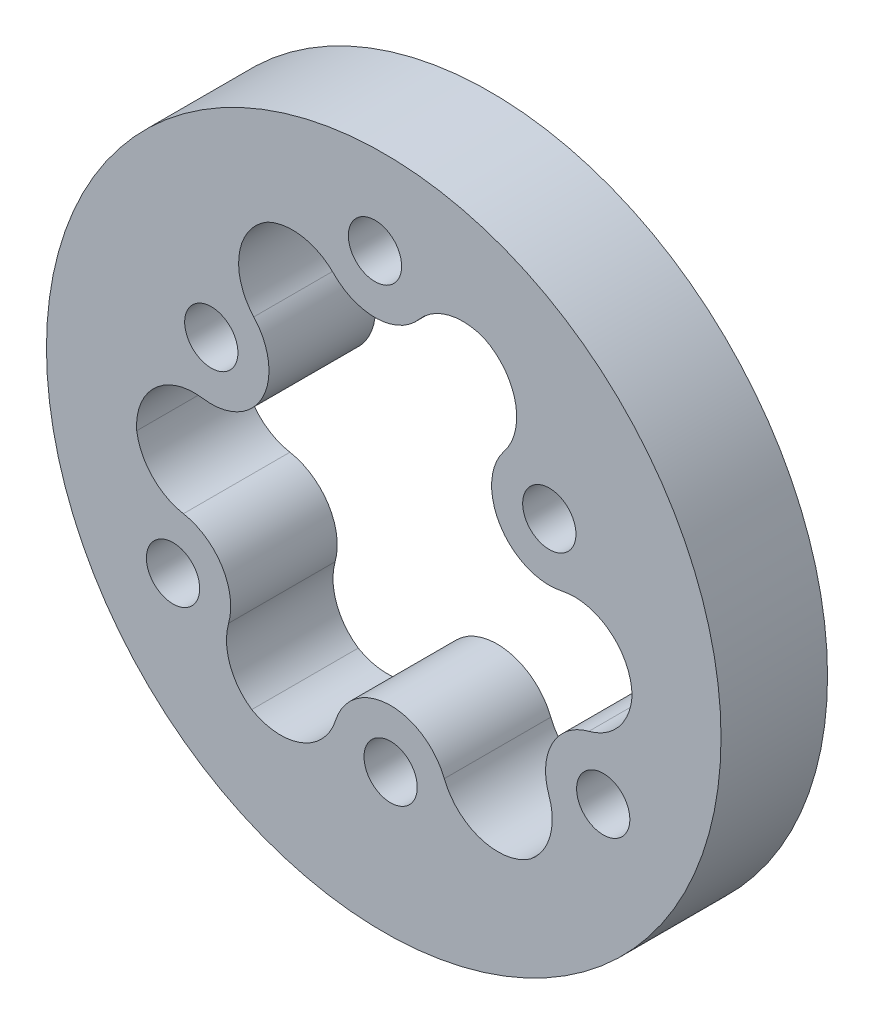
ISO-10303-21;
HEADER;
FILE_DESCRIPTION(('STEP AP214'),'2;1');
FILE_NAME('part.step','',(''),(''),'','','');
FILE_SCHEMA(('AUTOMOTIVE_DESIGN { 1 0 10303 214 1 1 1 1 }'));
ENDSEC;
DATA;
#1=APPLICATION_CONTEXT('core data for automotive mechanical design processes');
#2=APPLICATION_PROTOCOL_DEFINITION('international standard','automotive_design',2000,#1);
#3=PRODUCT_CONTEXT('',#1,'mechanical');
#4=PRODUCT('Part','Part','',(#3));
#5=PRODUCT_RELATED_PRODUCT_CATEGORY('part','',(#4));
#6=PRODUCT_DEFINITION_FORMATION('','',#4);
#7=PRODUCT_DEFINITION_CONTEXT('part definition',#1,'design');
#8=PRODUCT_DEFINITION('design','',#6,#7);
#9=PRODUCT_DEFINITION_SHAPE('','',#8);
#10=(LENGTH_UNIT() NAMED_UNIT(*) SI_UNIT(.MILLI.,.METRE.));
#11=(NAMED_UNIT(*) PLANE_ANGLE_UNIT() SI_UNIT($,.RADIAN.));
#12=(NAMED_UNIT(*) SI_UNIT($,.STERADIAN.) SOLID_ANGLE_UNIT());
#13=UNCERTAINTY_MEASURE_WITH_UNIT(LENGTH_MEASURE(1.E-05),#10,'distance_accuracy_value','');
#14=(GEOMETRIC_REPRESENTATION_CONTEXT(3) GLOBAL_UNCERTAINTY_ASSIGNED_CONTEXT((#13)) GLOBAL_UNIT_ASSIGNED_CONTEXT((#10,
#11,#12)) REPRESENTATION_CONTEXT('',''));
#15=CARTESIAN_POINT('',(0.,0.,0.));
#16=DIRECTION('',(0.,0.,1.));
#17=DIRECTION('',(1.,0.,0.));
#18=AXIS2_PLACEMENT_3D('',#15,#16,#17);
#19=CARTESIAN_POINT('',(0.,0.,6.));
#20=DIRECTION('',(0.,0.,1.));
#21=DIRECTION('',(1.,0.,0.));
#22=AXIS2_PLACEMENT_3D('',#19,#20,#21);
#23=PLANE('',#22);
#24=CARTESIAN_POINT('',(9.32635694032615,5.83258658072301,6.));
#25=DIRECTION('',(0.,0.,1.));
#26=DIRECTION('',(1.,0.,0.));
#27=AXIS2_PLACEMENT_3D('',#24,#25,#26);
#28=CIRCLE('',#27,1.50000000000002);
#29=CARTESIAN_POINT('',(10.8263569403262,5.83258658072301,6.));
#30=VERTEX_POINT('',#29);
#31=EDGE_CURVE('E333',#30,#30,#28,.T.);
#32=ORIENTED_EDGE('',*,*,#31,.F.);
#33=EDGE_LOOP('',(#32));
#34=FACE_BOUND('',#33,.T.);
#35=CARTESIAN_POINT('',(-11.8699088331424,-7.4232920118292,6.));
#36=DIRECTION('',(0.,0.,1.));
#37=DIRECTION('',(1.,0.,0.));
#38=AXIS2_PLACEMENT_3D('',#35,#36,#37);
#39=CIRCLE('',#38,1.50000000000014);
#40=CARTESIAN_POINT('',(-10.3699088331423,-7.4232920118292,6.));
#41=VERTEX_POINT('',#40);
#42=EDGE_CURVE('E216',#41,#41,#39,.T.);
#43=ORIENTED_EDGE('',*,*,#42,.F.);
#44=EDGE_LOOP('',(#43));
#45=FACE_BOUND('',#44,.T.);
#46=CARTESIAN_POINT('',(-0.493805045382954,13.9912885960213,6.));
#47=DIRECTION('',(0.,0.,1.));
#48=DIRECTION('',(1.,0.,0.));
#49=AXIS2_PLACEMENT_3D('',#46,#47,#48);
#50=CIRCLE('',#49,1.5);
#51=CARTESIAN_POINT('',(1.00619495461705,13.9912885960213,6.));
#52=VERTEX_POINT('',#51);
#53=EDGE_CURVE('E302',#52,#52,#50,.T.);
#54=ORIENTED_EDGE('',*,*,#53,.F.);
#55=EDGE_LOOP('',(#54));
#56=FACE_BOUND('',#55,.T.);
#57=CARTESIAN_POINT('',(0.,0.,6.));
#58=DIRECTION('',(0.,0.,1.));
#59=DIRECTION('',(1.,0.,0.));
#60=AXIS2_PLACEMENT_3D('',#57,#58,#59);
#61=CIRCLE('',#60,19.);
#62=CARTESIAN_POINT('',(19.,0.,6.));
#63=VERTEX_POINT('',#62);
#64=EDGE_CURVE('E11',#63,#63,#61,.T.);
#65=ORIENTED_EDGE('',*,*,#64,.T.);
#66=EDGE_LOOP('',(#65));
#67=FACE_BOUND('',#66,.T.);
#68=CARTESIAN_POINT('',(12.3637138785254,-6.56799658419206,6.));
#69=DIRECTION('',(0.,0.,1.));
#70=DIRECTION('',(1.,0.,0.));
#71=AXIS2_PLACEMENT_3D('',#68,#69,#70);
#72=CIRCLE('',#71,1.50000000000007);
#73=CARTESIAN_POINT('',(13.8637138785255,-6.56799658419206,6.));
#74=VERTEX_POINT('',#73);
#75=EDGE_CURVE('E296',#74,#74,#72,.T.);
#76=ORIENTED_EDGE('',*,*,#75,.F.);
#77=EDGE_LOOP('',(#76));
#78=FACE_BOUND('',#77,.T.);
#79=CARTESIAN_POINT('',(10.7377849521311,-0.512322478317354,6.));
#80=DIRECTION('',(0.,0.,1.));
#81=DIRECTION('',(1.,0.,0.));
#82=AXIS2_PLACEMENT_3D('',#79,#80,#81);
#83=CIRCLE('',#82,3.25000000000007);
#84=CARTESIAN_POINT('',(13.9877846391168,-0.510896086633181,6.));
#85=VERTEX_POINT('',#84);
#86=CARTESIAN_POINT('',(10.0320709462286,2.66013205120283,6.));
#87=VERTEX_POINT('',#86);
#88=EDGE_CURVE('E166',#85,#87,#83,.T.);
#89=ORIENTED_EDGE('',*,*,#88,.F.);
#90=CARTESIAN_POINT('',(10.7465486850771,-0.272380908414255,6.));
#91=DIRECTION('',(0.,0.,1.));
#92=DIRECTION('',(1.,0.,0.));
#93=AXIS2_PLACEMENT_3D('',#90,#91,#92);
#94=CIRCLE('',#93,3.25000000000007);
#95=CARTESIAN_POINT('',(11.5551312818012,-3.42018874630315,6.));
#96=VERTEX_POINT('',#95);
#97=EDGE_CURVE('E158',#96,#85,#94,.T.);
#98=ORIENTED_EDGE('',*,*,#97,.F.);
#99=CARTESIAN_POINT('',(12.3637138785254,-6.56799658419206,6.));
#100=DIRECTION('',(0.,0.,-1.));
#101=DIRECTION('',(1.,0.,0.));
#102=AXIS2_PLACEMENT_3D('',#99,#100,#101);
#103=CIRCLE('',#102,3.25);
#104=CARTESIAN_POINT('',(9.30272212200573,-7.66016390952212,6.));
#105=VERTEX_POINT('',#104);
#106=EDGE_CURVE('E213',#105,#96,#103,.T.);
#107=ORIENTED_EDGE('',*,*,#106,.F.);
#108=CARTESIAN_POINT('',(6.24173036548606,-8.75233123485219,6.));
#109=DIRECTION('',(0.,0.,1.));
#110=DIRECTION('',(1.,0.,0.));
#111=AXIS2_PLACEMENT_3D('',#108,#109,#110);
#112=CIRCLE('',#111,3.25000000000003);
#113=CARTESIAN_POINT('',(8.25384663526143,-11.3045632221342,6.));
#114=VERTEX_POINT('',#113);
#115=EDGE_CURVE('E211',#114,#105,#112,.T.);
#116=ORIENTED_EDGE('',*,*,#115,.F.);
#117=CARTESIAN_POINT('',(6.43564489280904,-8.61074763383888,6.));
#118=DIRECTION('',(0.,0.,1.));
#119=DIRECTION('',(1.,0.,0.));
#120=AXIS2_PLACEMENT_3D('',#117,#118,#119);
#121=CIRCLE('',#120,3.24999999999999);
#122=CARTESIAN_POINT('',(3.41181728566217,-9.80195147964207,6.));
#123=VERTEX_POINT('',#122);
#124=EDGE_CURVE('E209',#123,#114,#121,.T.);
#125=ORIENTED_EDGE('',*,*,#124,.F.);
#126=CARTESIAN_POINT('',(0.387989678515268,-10.9931553254453,6.));
#127=DIRECTION('',(0.,0.,-1.));
#128=DIRECTION('',(1.,0.,0.));
#129=AXIS2_PLACEMENT_3D('',#126,#127,#128);
#130=CIRCLE('',#129,3.25);
#131=CARTESIAN_POINT('',(-2.71229353935144,-10.0180943176032,6.));
#132=VERTEX_POINT('',#131);
#133=EDGE_CURVE('E207',#132,#123,#130,.T.);
#134=ORIENTED_EDGE('',*,*,#133,.F.);
#135=CARTESIAN_POINT('',(-5.81257675721816,-9.0430333097611,6.));
#136=DIRECTION('',(0.,0.,1.));
#137=DIRECTION('',(1.,0.,0.));
#138=AXIS2_PLACEMENT_3D('',#135,#136,#137);
#139=CIRCLE('',#138,3.25);
#140=CARTESIAN_POINT('',(-7.43634130927706,-11.858328796824,6.));
#141=VERTEX_POINT('',#140);
#142=EDGE_CURVE('E205',#141,#132,#139,.T.);
#143=ORIENTED_EDGE('',*,*,#142,.F.);
#144=CARTESIAN_POINT('',(-5.60916312873115,-9.17059371007586,6.));
#145=DIRECTION('',(0.,0.,1.));
#146=DIRECTION('',(1.,0.,0.));
#147=AXIS2_PLACEMENT_3D('',#144,#145,#146);
#148=CIRCLE('',#147,3.25000000000002);
#149=CARTESIAN_POINT('',(-8.73953598093682,-8.29694286095252,6.));
#150=VERTEX_POINT('',#149);
#151=EDGE_CURVE('E203',#150,#141,#148,.T.);
#152=ORIENTED_EDGE('',*,*,#151,.F.);
#153=CARTESIAN_POINT('',(-11.8699088331424,-7.4232920118292,6.));
#154=DIRECTION('',(0.,0.,-1.));
#155=DIRECTION('',(1.,0.,0.));
#156=AXIS2_PLACEMENT_3D('',#153,#154,#155);
#157=CIRCLE('',#156,3.25);
#158=CARTESIAN_POINT('',(-11.2852576038017,-4.22631172724338,6.));
#159=VERTEX_POINT('',#158);
#160=EDGE_CURVE('E201',#159,#150,#157,.T.);
#161=ORIENTED_EDGE('',*,*,#160,.F.);
#162=CARTESIAN_POINT('',(-10.7006063744611,-1.02933144265756,6.));
#163=DIRECTION('',(0.,0.,1.));
#164=DIRECTION('',(1.,0.,0.));
#165=AXIS2_PLACEMENT_3D('',#162,#163,#164);
#166=CIRCLE('',#165,3.25);
#167=CARTESIAN_POINT('',(-13.9169622466862,-1.49575925400966,6.));
#168=VERTEX_POINT('',#167);
#169=EDGE_CURVE('E199',#168,#159,#166,.T.);
#170=ORIENTED_EDGE('',*,*,#169,.F.);
#171=CARTESIAN_POINT('',(-10.6749486428857,-1.26805814998879,6.));
#172=DIRECTION('',(0.,0.,1.));
#173=DIRECTION('',(1.,0.,0.));
#174=AXIS2_PLACEMENT_3D('',#171,#172,#173);
#175=CIRCLE('',#174,3.25);
#176=CARTESIAN_POINT('',(-10.1946476308636,1.94625529736673,6.));
#177=VERTEX_POINT('',#176);
#178=EDGE_CURVE('E197',#177,#168,#175,.T.);
#179=ORIENTED_EDGE('',*,*,#178,.F.);
#180=CARTESIAN_POINT('',(-9.71434661884143,5.16056874472224,6.));
#181=DIRECTION('',(0.,0.,-1.));
#182=DIRECTION('',(1.,0.,0.));
#183=AXIS2_PLACEMENT_3D('',#180,#181,#182);
#184=CIRCLE('',#183,3.25);
#185=CARTESIAN_POINT('',(-7.31977740687714,7.35796226640032,6.));
#186=VERTEX_POINT('',#185);
#187=EDGE_CURVE('E195',#186,#177,#184,.T.);
#188=ORIENTED_EDGE('',*,*,#187,.F.);
#189=CARTESIAN_POINT('',(-4.92520819491286,9.55535578807839,6.));
#190=DIRECTION('',(0.,0.,1.));
#191=DIRECTION('',(1.,0.,0.));
#192=AXIS2_PLACEMENT_3D('',#189,#190,#191);
#193=CIRCLE('',#192,3.25);
#194=CARTESIAN_POINT('',(-6.55144332983929,12.3692248834577,6.));
#195=VERTEX_POINT('',#194);
#196=EDGE_CURVE('E193',#195,#186,#193,.T.);
#197=ORIENTED_EDGE('',*,*,#196,.F.);
#198=CARTESIAN_POINT('',(-5.1373855563459,9.44297461849011,6.));
#199=DIRECTION('',(0.,0.,1.));
#200=DIRECTION('',(1.,0.,0.));
#201=AXIS2_PLACEMENT_3D('',#198,#199,#200);
#202=CIRCLE('',#201,3.25);
#203=CARTESIAN_POINT('',(-2.81559530086442,11.7171316072557,6.));
#204=VERTEX_POINT('',#203);
#205=EDGE_CURVE('E191',#204,#195,#202,.T.);
#206=ORIENTED_EDGE('',*,*,#205,.F.);
#207=CARTESIAN_POINT('',(-0.493805045382954,13.9912885960213,6.));
#208=DIRECTION('',(0.,0.,-1.));
#209=DIRECTION('',(1.,0.,0.));
#210=AXIS2_PLACEMENT_3D('',#207,#208,#209);
#211=CIRCLE('',#210,3.25);
#212=CARTESIAN_POINT('',(1.98253548179602,11.8864756367655,6.));
#213=VERTEX_POINT('',#212);
#214=EDGE_CURVE('E189',#213,#204,#211,.T.);
#215=ORIENTED_EDGE('',*,*,#214,.F.);
#216=CARTESIAN_POINT('',(4.458876008975,9.78166267750975,6.));
#217=DIRECTION('',(0.,0.,1.));
#218=DIRECTION('',(1.,0.,0.));
#219=AXIS2_PLACEMENT_3D('',#216,#217,#218);
#220=CIRCLE('',#219,3.25000000000003);
#221=CARTESIAN_POINT('',(5.66311561142476,12.8003224761442,6.));
#222=VERTEX_POINT('',#221);
#223=EDGE_CURVE('E187',#222,#213,#220,.T.);
#224=ORIENTED_EDGE('',*,*,#223,.F.);
#225=CARTESIAN_POINT('',(4.23930375007668,9.87880578382764,6.));
#226=DIRECTION('',(0.,0.,1.));
#227=DIRECTION('',(1.,0.,0.));
#228=AXIS2_PLACEMENT_3D('',#225,#226,#227);
#229=CIRCLE('',#228,3.25);
#230=CARTESIAN_POINT('',(6.78283034520141,7.85569618227533,6.));
#231=VERTEX_POINT('',#230);
#232=EDGE_CURVE('E182',#231,#222,#229,.T.);
#233=ORIENTED_EDGE('',*,*,#232,.F.);
#234=CARTESIAN_POINT('',(9.32635694032615,5.83258658072301,6.));
#235=DIRECTION('',(0.,0.,-1.));
#236=DIRECTION('',(1.,0.,0.));
#237=AXIS2_PLACEMENT_3D('',#234,#235,#236);
#238=CIRCLE('',#237,3.25);
#239=EDGE_CURVE('E180',#87,#231,#238,.T.);
#240=ORIENTED_EDGE('',*,*,#239,.F.);
#241=EDGE_LOOP('',(#89,#98,#107,#116,#125,#134,#143,#152,#161,#170,#179,#188,#197,#206,#215,
#224,#233,#240));
#242=FACE_BOUND('',#241,.T.);
#243=CARTESIAN_POINT('',(-9.71434661884143,5.16056874472224,6.));
#244=DIRECTION('',(0.,0.,1.));
#245=DIRECTION('',(1.,0.,0.));
#246=AXIS2_PLACEMENT_3D('',#243,#244,#245);
#247=CIRCLE('',#246,1.5);
#248=CARTESIAN_POINT('',(-8.21434661884142,5.16056874472224,6.));
#249=VERTEX_POINT('',#248);
#250=EDGE_CURVE('E372',#249,#249,#247,.T.);
#251=ORIENTED_EDGE('',*,*,#250,.F.);
#252=EDGE_LOOP('',(#251));
#253=FACE_BOUND('',#252,.T.);
#254=CARTESIAN_POINT('',(0.387989678515268,-10.9931553254453,6.));
#255=DIRECTION('',(0.,0.,1.));
#256=DIRECTION('',(1.,0.,0.));
#257=AXIS2_PLACEMENT_3D('',#254,#255,#256);
#258=CIRCLE('',#257,1.50000000000007);
#259=CARTESIAN_POINT('',(1.88798967851534,-10.9931553254453,6.));
#260=VERTEX_POINT('',#259);
#261=EDGE_CURVE('E365',#260,#260,#258,.T.);
#262=ORIENTED_EDGE('',*,*,#261,.F.);
#263=EDGE_LOOP('',(#262));
#264=FACE_BOUND('',#263,.T.);
#265=ADVANCED_FACE('F33',(#34,#45,#56,#67,#78,#242,#253,#264),#23,.T.);
#266=CARTESIAN_POINT('',(0.,0.,0.));
#267=DIRECTION('',(0.,0.,1.));
#268=DIRECTION('',(1.,0.,0.));
#269=AXIS2_PLACEMENT_3D('',#266,#267,#268);
#270=PLANE('',#269);
#271=CARTESIAN_POINT('',(12.3637138785254,-6.56799658419206,0.));
#272=DIRECTION('',(0.,0.,1.));
#273=DIRECTION('',(1.,0.,0.));
#274=AXIS2_PLACEMENT_3D('',#271,#272,#273);
#275=CIRCLE('',#274,1.50000000000007);
#276=CARTESIAN_POINT('',(13.8637138785255,-6.56799658419206,0.));
#277=VERTEX_POINT('',#276);
#278=EDGE_CURVE('E174',#277,#277,#275,.T.);
#279=ORIENTED_EDGE('',*,*,#278,.T.);
#280=EDGE_LOOP('',(#279));
#281=FACE_BOUND('',#280,.T.);
#282=CARTESIAN_POINT('',(-0.493805045382954,13.9912885960213,0.));
#283=DIRECTION('',(0.,0.,1.));
#284=DIRECTION('',(1.,0.,0.));
#285=AXIS2_PLACEMENT_3D('',#282,#283,#284);
#286=CIRCLE('',#285,1.5);
#287=CARTESIAN_POINT('',(1.00619495461705,13.9912885960213,0.));
#288=VERTEX_POINT('',#287);
#289=EDGE_CURVE('E299',#288,#288,#286,.T.);
#290=ORIENTED_EDGE('',*,*,#289,.T.);
#291=EDGE_LOOP('',(#290));
#292=FACE_BOUND('',#291,.T.);
#293=CARTESIAN_POINT('',(0.,0.,0.));
#294=DIRECTION('',(0.,0.,1.));
#295=DIRECTION('',(1.,0.,0.));
#296=AXIS2_PLACEMENT_3D('',#293,#294,#295);
#297=CIRCLE('',#296,19.);
#298=CARTESIAN_POINT('',(19.,0.,0.));
#299=VERTEX_POINT('',#298);
#300=EDGE_CURVE('E37',#299,#299,#297,.T.);
#301=ORIENTED_EDGE('',*,*,#300,.F.);
#302=EDGE_LOOP('',(#301));
#303=FACE_BOUND('',#302,.T.);
#304=CARTESIAN_POINT('',(10.7465486850771,-0.272380908414255,0.));
#305=DIRECTION('',(0.,0.,1.));
#306=DIRECTION('',(1.,0.,0.));
#307=AXIS2_PLACEMENT_3D('',#304,#305,#306);
#308=CIRCLE('',#307,3.25000000000007);
#309=CARTESIAN_POINT('',(11.5551312818012,-3.42018874630315,0.));
#310=VERTEX_POINT('',#309);
#311=CARTESIAN_POINT('',(13.9877846391168,-0.510896086633181,0.));
#312=VERTEX_POINT('',#311);
#313=EDGE_CURVE('E56',#310,#312,#308,.T.);
#314=ORIENTED_EDGE('',*,*,#313,.T.);
#315=CARTESIAN_POINT('',(10.7377849521311,-0.512322478317354,0.));
#316=DIRECTION('',(0.,0.,1.));
#317=DIRECTION('',(1.,0.,0.));
#318=AXIS2_PLACEMENT_3D('',#315,#316,#317);
#319=CIRCLE('',#318,3.25000000000007);
#320=CARTESIAN_POINT('',(10.0320709462286,2.66013205120283,0.));
#321=VERTEX_POINT('',#320);
#322=EDGE_CURVE('E173',#312,#321,#319,.T.);
#323=ORIENTED_EDGE('',*,*,#322,.T.);
#324=CARTESIAN_POINT('',(9.32635694032615,5.83258658072301,0.));
#325=DIRECTION('',(0.,0.,-1.));
#326=DIRECTION('',(1.,0.,0.));
#327=AXIS2_PLACEMENT_3D('',#324,#325,#326);
#328=CIRCLE('',#327,3.25);
#329=CARTESIAN_POINT('',(6.78283034520141,7.85569618227533,0.));
#330=VERTEX_POINT('',#329);
#331=EDGE_CURVE('E218',#321,#330,#328,.T.);
#332=ORIENTED_EDGE('',*,*,#331,.T.);
#333=CARTESIAN_POINT('',(4.23930375007668,9.87880578382764,0.));
#334=DIRECTION('',(0.,0.,1.));
#335=DIRECTION('',(1.,0.,0.));
#336=AXIS2_PLACEMENT_3D('',#333,#334,#335);
#337=CIRCLE('',#336,3.25);
#338=CARTESIAN_POINT('',(5.66311561142476,12.8003224761442,0.));
#339=VERTEX_POINT('',#338);
#340=EDGE_CURVE('E221',#330,#339,#337,.T.);
#341=ORIENTED_EDGE('',*,*,#340,.T.);
#342=CARTESIAN_POINT('',(4.458876008975,9.78166267750975,0.));
#343=DIRECTION('',(0.,0.,1.));
#344=DIRECTION('',(1.,0.,0.));
#345=AXIS2_PLACEMENT_3D('',#342,#343,#344);
#346=CIRCLE('',#345,3.25000000000003);
#347=CARTESIAN_POINT('',(1.98253548179602,11.8864756367655,0.));
#348=VERTEX_POINT('',#347);
#349=EDGE_CURVE('E224',#339,#348,#346,.T.);
#350=ORIENTED_EDGE('',*,*,#349,.T.);
#351=CARTESIAN_POINT('',(-0.493805045382954,13.9912885960213,0.));
#352=DIRECTION('',(0.,0.,-1.));
#353=DIRECTION('',(1.,0.,0.));
#354=AXIS2_PLACEMENT_3D('',#351,#352,#353);
#355=CIRCLE('',#354,3.25);
#356=CARTESIAN_POINT('',(-2.81559530086442,11.7171316072557,0.));
#357=VERTEX_POINT('',#356);
#358=EDGE_CURVE('E227',#348,#357,#355,.T.);
#359=ORIENTED_EDGE('',*,*,#358,.T.);
#360=CARTESIAN_POINT('',(-5.1373855563459,9.44297461849011,0.));
#361=DIRECTION('',(0.,0.,1.));
#362=DIRECTION('',(1.,0.,0.));
#363=AXIS2_PLACEMENT_3D('',#360,#361,#362);
#364=CIRCLE('',#363,3.25);
#365=CARTESIAN_POINT('',(-6.55144332983929,12.3692248834577,0.));
#366=VERTEX_POINT('',#365);
#367=EDGE_CURVE('E230',#357,#366,#364,.T.);
#368=ORIENTED_EDGE('',*,*,#367,.T.);
#369=CARTESIAN_POINT('',(-4.92520819491286,9.55535578807839,0.));
#370=DIRECTION('',(0.,0.,1.));
#371=DIRECTION('',(1.,0.,0.));
#372=AXIS2_PLACEMENT_3D('',#369,#370,#371);
#373=CIRCLE('',#372,3.25);
#374=CARTESIAN_POINT('',(-7.31977740687714,7.35796226640032,0.));
#375=VERTEX_POINT('',#374);
#376=EDGE_CURVE('E233',#366,#375,#373,.T.);
#377=ORIENTED_EDGE('',*,*,#376,.T.);
#378=CARTESIAN_POINT('',(-9.71434661884143,5.16056874472224,0.));
#379=DIRECTION('',(0.,0.,-1.));
#380=DIRECTION('',(1.,0.,0.));
#381=AXIS2_PLACEMENT_3D('',#378,#379,#380);
#382=CIRCLE('',#381,3.25);
#383=CARTESIAN_POINT('',(-10.1946476308636,1.94625529736673,0.));
#384=VERTEX_POINT('',#383);
#385=EDGE_CURVE('E236',#375,#384,#382,.T.);
#386=ORIENTED_EDGE('',*,*,#385,.T.);
#387=CARTESIAN_POINT('',(-10.6749486428857,-1.26805814998879,0.));
#388=DIRECTION('',(0.,0.,1.));
#389=DIRECTION('',(1.,0.,0.));
#390=AXIS2_PLACEMENT_3D('',#387,#388,#389);
#391=CIRCLE('',#390,3.25);
#392=CARTESIAN_POINT('',(-13.9169622466862,-1.49575925400966,0.));
#393=VERTEX_POINT('',#392);
#394=EDGE_CURVE('E239',#384,#393,#391,.T.);
#395=ORIENTED_EDGE('',*,*,#394,.T.);
#396=CARTESIAN_POINT('',(-10.7006063744611,-1.02933144265756,0.));
#397=DIRECTION('',(0.,0.,1.));
#398=DIRECTION('',(1.,0.,0.));
#399=AXIS2_PLACEMENT_3D('',#396,#397,#398);
#400=CIRCLE('',#399,3.25);
#401=CARTESIAN_POINT('',(-11.2852576038017,-4.22631172724338,0.));
#402=VERTEX_POINT('',#401);
#403=EDGE_CURVE('E242',#393,#402,#400,.T.);
#404=ORIENTED_EDGE('',*,*,#403,.T.);
#405=CARTESIAN_POINT('',(-11.8699088331424,-7.4232920118292,0.));
#406=DIRECTION('',(0.,0.,-1.));
#407=DIRECTION('',(1.,0.,0.));
#408=AXIS2_PLACEMENT_3D('',#405,#406,#407);
#409=CIRCLE('',#408,3.25);
#410=CARTESIAN_POINT('',(-8.73953598093682,-8.29694286095252,0.));
#411=VERTEX_POINT('',#410);
#412=EDGE_CURVE('E245',#402,#411,#409,.T.);
#413=ORIENTED_EDGE('',*,*,#412,.T.);
#414=CARTESIAN_POINT('',(-5.60916312873115,-9.17059371007586,0.));
#415=DIRECTION('',(0.,0.,1.));
#416=DIRECTION('',(1.,0.,0.));
#417=AXIS2_PLACEMENT_3D('',#414,#415,#416);
#418=CIRCLE('',#417,3.25000000000002);
#419=CARTESIAN_POINT('',(-7.43634130927706,-11.858328796824,0.));
#420=VERTEX_POINT('',#419);
#421=EDGE_CURVE('E248',#411,#420,#418,.T.);
#422=ORIENTED_EDGE('',*,*,#421,.T.);
#423=CARTESIAN_POINT('',(-5.81257675721816,-9.0430333097611,0.));
#424=DIRECTION('',(0.,0.,1.));
#425=DIRECTION('',(1.,0.,0.));
#426=AXIS2_PLACEMENT_3D('',#423,#424,#425);
#427=CIRCLE('',#426,3.25);
#428=CARTESIAN_POINT('',(-2.71229353935144,-10.0180943176032,0.));
#429=VERTEX_POINT('',#428);
#430=EDGE_CURVE('E251',#420,#429,#427,.T.);
#431=ORIENTED_EDGE('',*,*,#430,.T.);
#432=CARTESIAN_POINT('',(0.387989678515268,-10.9931553254453,0.));
#433=DIRECTION('',(0.,0.,-1.));
#434=DIRECTION('',(1.,0.,0.));
#435=AXIS2_PLACEMENT_3D('',#432,#433,#434);
#436=CIRCLE('',#435,3.25);
#437=CARTESIAN_POINT('',(3.41181728566217,-9.80195147964207,0.));
#438=VERTEX_POINT('',#437);
#439=EDGE_CURVE('E254',#429,#438,#436,.T.);
#440=ORIENTED_EDGE('',*,*,#439,.T.);
#441=CARTESIAN_POINT('',(6.43564489280904,-8.61074763383888,0.));
#442=DIRECTION('',(0.,0.,1.));
#443=DIRECTION('',(1.,0.,0.));
#444=AXIS2_PLACEMENT_3D('',#441,#442,#443);
#445=CIRCLE('',#444,3.24999999999999);
#446=CARTESIAN_POINT('',(8.25384663526143,-11.3045632221342,0.));
#447=VERTEX_POINT('',#446);
#448=EDGE_CURVE('E257',#438,#447,#445,.T.);
#449=ORIENTED_EDGE('',*,*,#448,.T.);
#450=CARTESIAN_POINT('',(6.24173036548606,-8.75233123485219,0.));
#451=DIRECTION('',(0.,0.,1.));
#452=DIRECTION('',(1.,0.,0.));
#453=AXIS2_PLACEMENT_3D('',#450,#451,#452);
#454=CIRCLE('',#453,3.25000000000003);
#455=CARTESIAN_POINT('',(9.30272212200573,-7.66016390952212,0.));
#456=VERTEX_POINT('',#455);
#457=EDGE_CURVE('E260',#447,#456,#454,.T.);
#458=ORIENTED_EDGE('',*,*,#457,.T.);
#459=CARTESIAN_POINT('',(12.3637138785254,-6.56799658419206,0.));
#460=DIRECTION('',(0.,0.,-1.));
#461=DIRECTION('',(1.,0.,0.));
#462=AXIS2_PLACEMENT_3D('',#459,#460,#461);
#463=CIRCLE('',#462,3.25);
#464=EDGE_CURVE('E167',#456,#310,#463,.T.);
#465=ORIENTED_EDGE('',*,*,#464,.T.);
#466=EDGE_LOOP('',(#314,#323,#332,#341,#350,#359,#368,#377,#386,#395,#404,#413,#422,#431,#440,
#449,#458,#465));
#467=FACE_BOUND('',#466,.T.);
#468=CARTESIAN_POINT('',(-11.8699088331424,-7.4232920118292,0.));
#469=DIRECTION('',(0.,0.,1.));
#470=DIRECTION('',(1.,0.,0.));
#471=AXIS2_PLACEMENT_3D('',#468,#469,#470);
#472=CIRCLE('',#471,1.50000000000014);
#473=CARTESIAN_POINT('',(-10.3699088331423,-7.4232920118292,0.));
#474=VERTEX_POINT('',#473);
#475=EDGE_CURVE('E352',#474,#474,#472,.T.);
#476=ORIENTED_EDGE('',*,*,#475,.T.);
#477=EDGE_LOOP('',(#476));
#478=FACE_BOUND('',#477,.T.);
#479=CARTESIAN_POINT('',(-9.71434661884143,5.16056874472224,0.));
#480=DIRECTION('',(0.,0.,1.));
#481=DIRECTION('',(1.,0.,0.));
#482=AXIS2_PLACEMENT_3D('',#479,#480,#481);
#483=CIRCLE('',#482,1.5);
#484=CARTESIAN_POINT('',(-8.21434661884142,5.16056874472224,0.));
#485=VERTEX_POINT('',#484);
#486=EDGE_CURVE('E356',#485,#485,#483,.T.);
#487=ORIENTED_EDGE('',*,*,#486,.T.);
#488=EDGE_LOOP('',(#487));
#489=FACE_BOUND('',#488,.T.);
#490=CARTESIAN_POINT('',(9.32635694032615,5.83258658072301,0.));
#491=DIRECTION('',(0.,0.,1.));
#492=DIRECTION('',(1.,0.,0.));
#493=AXIS2_PLACEMENT_3D('',#490,#491,#492);
#494=CIRCLE('',#493,1.50000000000002);
#495=CARTESIAN_POINT('',(10.8263569403262,5.83258658072301,0.));
#496=VERTEX_POINT('',#495);
#497=EDGE_CURVE('E360',#496,#496,#494,.T.);
#498=ORIENTED_EDGE('',*,*,#497,.T.);
#499=EDGE_LOOP('',(#498));
#500=FACE_BOUND('',#499,.T.);
#501=CARTESIAN_POINT('',(0.387989678515268,-10.9931553254453,0.));
#502=DIRECTION('',(0.,0.,1.));
#503=DIRECTION('',(1.,0.,0.));
#504=AXIS2_PLACEMENT_3D('',#501,#502,#503);
#505=CIRCLE('',#504,1.50000000000007);
#506=CARTESIAN_POINT('',(1.88798967851534,-10.9931553254453,0.));
#507=VERTEX_POINT('',#506);
#508=EDGE_CURVE('E363',#507,#507,#505,.T.);
#509=ORIENTED_EDGE('',*,*,#508,.T.);
#510=EDGE_LOOP('',(#509));
#511=FACE_BOUND('',#510,.T.);
#512=ADVANCED_FACE('F308',(#281,#292,#303,#467,#478,#489,#500,#511),#270,.F.);
#513=CARTESIAN_POINT('',(0.,0.,6.));
#514=DIRECTION('',(0.,0.,-1.));
#515=DIRECTION('',(-1.,0.,0.));
#516=AXIS2_PLACEMENT_3D('',#513,#514,#515);
#517=CYLINDRICAL_SURFACE('',#516,19.);
#518=ORIENTED_EDGE('',*,*,#64,.F.);
#519=EDGE_LOOP('',(#518));
#520=FACE_BOUND('',#519,.T.);
#521=ORIENTED_EDGE('',*,*,#300,.T.);
#522=EDGE_LOOP('',(#521));
#523=FACE_BOUND('',#522,.T.);
#524=ADVANCED_FACE('F35',(#520,#523),#517,.T.);
#525=CARTESIAN_POINT('',(-0.493805045382954,13.9912885960213,6.));
#526=DIRECTION('',(0.,0.,-1.));
#527=DIRECTION('',(-1.,0.,0.));
#528=AXIS2_PLACEMENT_3D('',#525,#526,#527);
#529=CYLINDRICAL_SURFACE('',#528,1.5);
#530=ORIENTED_EDGE('',*,*,#53,.T.);
#531=EDGE_LOOP('',(#530));
#532=FACE_BOUND('',#531,.T.);
#533=ORIENTED_EDGE('',*,*,#289,.F.);
#534=EDGE_LOOP('',(#533));
#535=FACE_BOUND('',#534,.T.);
#536=ADVANCED_FACE('F311',(#532,#535),#529,.F.);
#537=CARTESIAN_POINT('',(12.3637138785254,-6.56799658419206,6.));
#538=DIRECTION('',(0.,0.,-1.));
#539=DIRECTION('',(-1.,0.,0.));
#540=AXIS2_PLACEMENT_3D('',#537,#538,#539);
#541=CYLINDRICAL_SURFACE('',#540,1.50000000000007);
#542=ORIENTED_EDGE('',*,*,#75,.T.);
#543=EDGE_LOOP('',(#542));
#544=FACE_BOUND('',#543,.T.);
#545=ORIENTED_EDGE('',*,*,#278,.F.);
#546=EDGE_LOOP('',(#545));
#547=FACE_BOUND('',#546,.T.);
#548=ADVANCED_FACE('F313',(#544,#547),#541,.F.);
#549=CARTESIAN_POINT('',(10.7465486850771,-0.272380908414255,6.));
#550=DIRECTION('',(0.,0.,-1.));
#551=DIRECTION('',(-1.,0.,0.));
#552=AXIS2_PLACEMENT_3D('',#549,#550,#551);
#553=CYLINDRICAL_SURFACE('',#552,3.25000000000007);
#554=ORIENTED_EDGE('',*,*,#313,.F.);
#555=DIRECTION('',(0.,0.,-1.));
#556=VECTOR('',#555,1.);
#557=CARTESIAN_POINT('',(11.5551312818012,-3.42018874630315,6.));
#558=LINE('',#557,#556);
#559=EDGE_CURVE('E162',#96,#310,#558,.T.);
#560=ORIENTED_EDGE('',*,*,#559,.F.);
#561=ORIENTED_EDGE('',*,*,#97,.T.);
#562=DIRECTION('',(0.,0.,-1.));
#563=VECTOR('',#562,1.);
#564=CARTESIAN_POINT('',(13.9877846391168,-0.510896086633181,6.));
#565=LINE('',#564,#563);
#566=EDGE_CURVE('E161',#85,#312,#565,.T.);
#567=ORIENTED_EDGE('',*,*,#566,.T.);
#568=EDGE_LOOP('',(#554,#560,#561,#567));
#569=FACE_BOUND('',#568,.T.);
#570=ADVANCED_FACE('F160',(#569),#553,.F.);
#571=CARTESIAN_POINT('',(10.7377849521311,-0.512322478317354,6.));
#572=DIRECTION('',(0.,0.,-1.));
#573=DIRECTION('',(-1.,0.,0.));
#574=AXIS2_PLACEMENT_3D('',#571,#572,#573);
#575=CYLINDRICAL_SURFACE('',#574,3.25000000000007);
#576=ORIENTED_EDGE('',*,*,#322,.F.);
#577=ORIENTED_EDGE('',*,*,#566,.F.);
#578=ORIENTED_EDGE('',*,*,#88,.T.);
#579=DIRECTION('',(0.,0.,-1.));
#580=VECTOR('',#579,1.);
#581=CARTESIAN_POINT('',(10.0320709462286,2.66013205120283,6.));
#582=LINE('',#581,#580);
#583=EDGE_CURVE('E175',#87,#321,#582,.T.);
#584=ORIENTED_EDGE('',*,*,#583,.T.);
#585=EDGE_LOOP('',(#576,#577,#578,#584));
#586=FACE_BOUND('',#585,.T.);
#587=ADVANCED_FACE('F170',(#586),#575,.F.);
#588=CARTESIAN_POINT('',(9.32635694032615,5.83258658072301,6.));
#589=DIRECTION('',(0.,0.,-1.));
#590=DIRECTION('',(-1.,0.,0.));
#591=AXIS2_PLACEMENT_3D('',#588,#589,#590);
#592=CYLINDRICAL_SURFACE('',#591,3.25);
#593=ORIENTED_EDGE('',*,*,#331,.F.);
#594=ORIENTED_EDGE('',*,*,#583,.F.);
#595=ORIENTED_EDGE('',*,*,#239,.T.);
#596=DIRECTION('',(0.,0.,-1.));
#597=VECTOR('',#596,1.);
#598=CARTESIAN_POINT('',(6.78283034520141,7.85569618227533,6.));
#599=LINE('',#598,#597);
#600=EDGE_CURVE('E293',#231,#330,#599,.T.);
#601=ORIENTED_EDGE('',*,*,#600,.T.);
#602=EDGE_LOOP('',(#593,#594,#595,#601));
#603=FACE_BOUND('',#602,.T.);
#604=ADVANCED_FACE('F448',(#603),#592,.T.);
#605=CARTESIAN_POINT('',(4.23930375007668,9.87880578382764,6.));
#606=DIRECTION('',(0.,0.,-1.));
#607=DIRECTION('',(-1.,0.,0.));
#608=AXIS2_PLACEMENT_3D('',#605,#606,#607);
#609=CYLINDRICAL_SURFACE('',#608,3.25);
#610=ORIENTED_EDGE('',*,*,#340,.F.);
#611=ORIENTED_EDGE('',*,*,#600,.F.);
#612=ORIENTED_EDGE('',*,*,#232,.T.);
#613=DIRECTION('',(0.,0.,-1.));
#614=VECTOR('',#613,1.);
#615=CARTESIAN_POINT('',(5.66311561142476,12.8003224761442,6.));
#616=LINE('',#615,#614);
#617=EDGE_CURVE('E291',#222,#339,#616,.T.);
#618=ORIENTED_EDGE('',*,*,#617,.T.);
#619=EDGE_LOOP('',(#610,#611,#612,#618));
#620=FACE_BOUND('',#619,.T.);
#621=ADVANCED_FACE('F444',(#620),#609,.F.);
#622=CARTESIAN_POINT('',(4.458876008975,9.78166267750975,6.));
#623=DIRECTION('',(0.,0.,-1.));
#624=DIRECTION('',(-1.,0.,0.));
#625=AXIS2_PLACEMENT_3D('',#622,#623,#624);
#626=CYLINDRICAL_SURFACE('',#625,3.25000000000003);
#627=ORIENTED_EDGE('',*,*,#349,.F.);
#628=ORIENTED_EDGE('',*,*,#617,.F.);
#629=ORIENTED_EDGE('',*,*,#223,.T.);
#630=DIRECTION('',(0.,0.,-1.));
#631=VECTOR('',#630,1.);
#632=CARTESIAN_POINT('',(1.98253548179602,11.8864756367655,6.));
#633=LINE('',#632,#631);
#634=EDGE_CURVE('E289',#213,#348,#633,.T.);
#635=ORIENTED_EDGE('',*,*,#634,.T.);
#636=EDGE_LOOP('',(#627,#628,#629,#635));
#637=FACE_BOUND('',#636,.T.);
#638=ADVANCED_FACE('F440',(#637),#626,.F.);
#639=CARTESIAN_POINT('',(-0.493805045382954,13.9912885960213,6.));
#640=DIRECTION('',(0.,0.,-1.));
#641=DIRECTION('',(-1.,0.,0.));
#642=AXIS2_PLACEMENT_3D('',#639,#640,#641);
#643=CYLINDRICAL_SURFACE('',#642,3.25);
#644=ORIENTED_EDGE('',*,*,#358,.F.);
#645=ORIENTED_EDGE('',*,*,#634,.F.);
#646=ORIENTED_EDGE('',*,*,#214,.T.);
#647=DIRECTION('',(0.,0.,-1.));
#648=VECTOR('',#647,1.);
#649=CARTESIAN_POINT('',(-2.81559530086442,11.7171316072557,6.));
#650=LINE('',#649,#648);
#651=EDGE_CURVE('E287',#204,#357,#650,.T.);
#652=ORIENTED_EDGE('',*,*,#651,.T.);
#653=EDGE_LOOP('',(#644,#645,#646,#652));
#654=FACE_BOUND('',#653,.T.);
#655=ADVANCED_FACE('F436',(#654),#643,.T.);
#656=CARTESIAN_POINT('',(-5.1373855563459,9.44297461849011,6.));
#657=DIRECTION('',(0.,0.,-1.));
#658=DIRECTION('',(-1.,0.,0.));
#659=AXIS2_PLACEMENT_3D('',#656,#657,#658);
#660=CYLINDRICAL_SURFACE('',#659,3.25);
#661=ORIENTED_EDGE('',*,*,#367,.F.);
#662=ORIENTED_EDGE('',*,*,#651,.F.);
#663=ORIENTED_EDGE('',*,*,#205,.T.);
#664=DIRECTION('',(0.,0.,-1.));
#665=VECTOR('',#664,1.);
#666=CARTESIAN_POINT('',(-6.55144332983929,12.3692248834577,6.));
#667=LINE('',#666,#665);
#668=EDGE_CURVE('E285',#195,#366,#667,.T.);
#669=ORIENTED_EDGE('',*,*,#668,.T.);
#670=EDGE_LOOP('',(#661,#662,#663,#669));
#671=FACE_BOUND('',#670,.T.);
#672=ADVANCED_FACE('F432',(#671),#660,.F.);
#673=CARTESIAN_POINT('',(-4.92520819491286,9.55535578807839,6.));
#674=DIRECTION('',(0.,0.,-1.));
#675=DIRECTION('',(-1.,0.,0.));
#676=AXIS2_PLACEMENT_3D('',#673,#674,#675);
#677=CYLINDRICAL_SURFACE('',#676,3.25);
#678=ORIENTED_EDGE('',*,*,#376,.F.);
#679=ORIENTED_EDGE('',*,*,#668,.F.);
#680=ORIENTED_EDGE('',*,*,#196,.T.);
#681=DIRECTION('',(0.,0.,-1.));
#682=VECTOR('',#681,1.);
#683=CARTESIAN_POINT('',(-7.31977740687714,7.35796226640032,6.));
#684=LINE('',#683,#682);
#685=EDGE_CURVE('E283',#186,#375,#684,.T.);
#686=ORIENTED_EDGE('',*,*,#685,.T.);
#687=EDGE_LOOP('',(#678,#679,#680,#686));
#688=FACE_BOUND('',#687,.T.);
#689=ADVANCED_FACE('F428',(#688),#677,.F.);
#690=CARTESIAN_POINT('',(-9.71434661884143,5.16056874472224,6.));
#691=DIRECTION('',(0.,0.,-1.));
#692=DIRECTION('',(-1.,0.,0.));
#693=AXIS2_PLACEMENT_3D('',#690,#691,#692);
#694=CYLINDRICAL_SURFACE('',#693,3.25);
#695=ORIENTED_EDGE('',*,*,#385,.F.);
#696=ORIENTED_EDGE('',*,*,#685,.F.);
#697=ORIENTED_EDGE('',*,*,#187,.T.);
#698=DIRECTION('',(0.,0.,-1.));
#699=VECTOR('',#698,1.);
#700=CARTESIAN_POINT('',(-10.1946476308636,1.94625529736673,6.));
#701=LINE('',#700,#699);
#702=EDGE_CURVE('E281',#177,#384,#701,.T.);
#703=ORIENTED_EDGE('',*,*,#702,.T.);
#704=EDGE_LOOP('',(#695,#696,#697,#703));
#705=FACE_BOUND('',#704,.T.);
#706=ADVANCED_FACE('F424',(#705),#694,.T.);
#707=CARTESIAN_POINT('',(-10.6749486428857,-1.26805814998879,6.));
#708=DIRECTION('',(0.,0.,-1.));
#709=DIRECTION('',(-1.,0.,0.));
#710=AXIS2_PLACEMENT_3D('',#707,#708,#709);
#711=CYLINDRICAL_SURFACE('',#710,3.25);
#712=ORIENTED_EDGE('',*,*,#394,.F.);
#713=ORIENTED_EDGE('',*,*,#702,.F.);
#714=ORIENTED_EDGE('',*,*,#178,.T.);
#715=DIRECTION('',(0.,0.,-1.));
#716=VECTOR('',#715,1.);
#717=CARTESIAN_POINT('',(-13.9169622466862,-1.49575925400966,6.));
#718=LINE('',#717,#716);
#719=EDGE_CURVE('E279',#168,#393,#718,.T.);
#720=ORIENTED_EDGE('',*,*,#719,.T.);
#721=EDGE_LOOP('',(#712,#713,#714,#720));
#722=FACE_BOUND('',#721,.T.);
#723=ADVANCED_FACE('F420',(#722),#711,.F.);
#724=CARTESIAN_POINT('',(-10.7006063744611,-1.02933144265756,6.));
#725=DIRECTION('',(0.,0.,-1.));
#726=DIRECTION('',(-1.,0.,0.));
#727=AXIS2_PLACEMENT_3D('',#724,#725,#726);
#728=CYLINDRICAL_SURFACE('',#727,3.25);
#729=ORIENTED_EDGE('',*,*,#403,.F.);
#730=ORIENTED_EDGE('',*,*,#719,.F.);
#731=ORIENTED_EDGE('',*,*,#169,.T.);
#732=DIRECTION('',(0.,0.,-1.));
#733=VECTOR('',#732,1.);
#734=CARTESIAN_POINT('',(-11.2852576038017,-4.22631172724338,6.));
#735=LINE('',#734,#733);
#736=EDGE_CURVE('E277',#159,#402,#735,.T.);
#737=ORIENTED_EDGE('',*,*,#736,.T.);
#738=EDGE_LOOP('',(#729,#730,#731,#737));
#739=FACE_BOUND('',#738,.T.);
#740=ADVANCED_FACE('F416',(#739),#728,.F.);
#741=CARTESIAN_POINT('',(-11.8699088331424,-7.4232920118292,6.));
#742=DIRECTION('',(0.,0.,-1.));
#743=DIRECTION('',(-1.,0.,0.));
#744=AXIS2_PLACEMENT_3D('',#741,#742,#743);
#745=CYLINDRICAL_SURFACE('',#744,3.25);
#746=ORIENTED_EDGE('',*,*,#412,.F.);
#747=ORIENTED_EDGE('',*,*,#736,.F.);
#748=ORIENTED_EDGE('',*,*,#160,.T.);
#749=DIRECTION('',(0.,0.,-1.));
#750=VECTOR('',#749,1.);
#751=CARTESIAN_POINT('',(-8.73953598093682,-8.29694286095252,6.));
#752=LINE('',#751,#750);
#753=EDGE_CURVE('E275',#150,#411,#752,.T.);
#754=ORIENTED_EDGE('',*,*,#753,.T.);
#755=EDGE_LOOP('',(#746,#747,#748,#754));
#756=FACE_BOUND('',#755,.T.);
#757=ADVANCED_FACE('F412',(#756),#745,.T.);
#758=CARTESIAN_POINT('',(-5.60916312873115,-9.17059371007586,6.));
#759=DIRECTION('',(0.,0.,-1.));
#760=DIRECTION('',(-1.,0.,0.));
#761=AXIS2_PLACEMENT_3D('',#758,#759,#760);
#762=CYLINDRICAL_SURFACE('',#761,3.25000000000002);
#763=ORIENTED_EDGE('',*,*,#421,.F.);
#764=ORIENTED_EDGE('',*,*,#753,.F.);
#765=ORIENTED_EDGE('',*,*,#151,.T.);
#766=DIRECTION('',(0.,0.,-1.));
#767=VECTOR('',#766,1.);
#768=CARTESIAN_POINT('',(-7.43634130927706,-11.858328796824,6.));
#769=LINE('',#768,#767);
#770=EDGE_CURVE('E273',#141,#420,#769,.T.);
#771=ORIENTED_EDGE('',*,*,#770,.T.);
#772=EDGE_LOOP('',(#763,#764,#765,#771));
#773=FACE_BOUND('',#772,.T.);
#774=ADVANCED_FACE('F408',(#773),#762,.F.);
#775=CARTESIAN_POINT('',(-5.81257675721816,-9.0430333097611,6.));
#776=DIRECTION('',(0.,0.,-1.));
#777=DIRECTION('',(-1.,0.,0.));
#778=AXIS2_PLACEMENT_3D('',#775,#776,#777);
#779=CYLINDRICAL_SURFACE('',#778,3.25);
#780=ORIENTED_EDGE('',*,*,#430,.F.);
#781=ORIENTED_EDGE('',*,*,#770,.F.);
#782=ORIENTED_EDGE('',*,*,#142,.T.);
#783=DIRECTION('',(0.,0.,-1.));
#784=VECTOR('',#783,1.);
#785=CARTESIAN_POINT('',(-2.71229353935144,-10.0180943176032,6.));
#786=LINE('',#785,#784);
#787=EDGE_CURVE('E271',#132,#429,#786,.T.);
#788=ORIENTED_EDGE('',*,*,#787,.T.);
#789=EDGE_LOOP('',(#780,#781,#782,#788));
#790=FACE_BOUND('',#789,.T.);
#791=ADVANCED_FACE('F404',(#790),#779,.F.);
#792=CARTESIAN_POINT('',(0.387989678515268,-10.9931553254453,6.));
#793=DIRECTION('',(0.,0.,-1.));
#794=DIRECTION('',(-1.,0.,0.));
#795=AXIS2_PLACEMENT_3D('',#792,#793,#794);
#796=CYLINDRICAL_SURFACE('',#795,3.25);
#797=ORIENTED_EDGE('',*,*,#439,.F.);
#798=ORIENTED_EDGE('',*,*,#787,.F.);
#799=ORIENTED_EDGE('',*,*,#133,.T.);
#800=DIRECTION('',(0.,0.,-1.));
#801=VECTOR('',#800,1.);
#802=CARTESIAN_POINT('',(3.41181728566217,-9.80195147964207,6.));
#803=LINE('',#802,#801);
#804=EDGE_CURVE('E269',#123,#438,#803,.T.);
#805=ORIENTED_EDGE('',*,*,#804,.T.);
#806=EDGE_LOOP('',(#797,#798,#799,#805));
#807=FACE_BOUND('',#806,.T.);
#808=ADVANCED_FACE('F400',(#807),#796,.T.);
#809=CARTESIAN_POINT('',(6.43564489280904,-8.61074763383888,6.));
#810=DIRECTION('',(0.,0.,-1.));
#811=DIRECTION('',(-1.,0.,0.));
#812=AXIS2_PLACEMENT_3D('',#809,#810,#811);
#813=CYLINDRICAL_SURFACE('',#812,3.24999999999999);
#814=ORIENTED_EDGE('',*,*,#448,.F.);
#815=ORIENTED_EDGE('',*,*,#804,.F.);
#816=ORIENTED_EDGE('',*,*,#124,.T.);
#817=DIRECTION('',(0.,0.,-1.));
#818=VECTOR('',#817,1.);
#819=CARTESIAN_POINT('',(8.25384663526143,-11.3045632221342,6.));
#820=LINE('',#819,#818);
#821=EDGE_CURVE('E267',#114,#447,#820,.T.);
#822=ORIENTED_EDGE('',*,*,#821,.T.);
#823=EDGE_LOOP('',(#814,#815,#816,#822));
#824=FACE_BOUND('',#823,.T.);
#825=ADVANCED_FACE('F396',(#824),#813,.F.);
#826=CARTESIAN_POINT('',(6.24173036548606,-8.75233123485219,6.));
#827=DIRECTION('',(0.,0.,-1.));
#828=DIRECTION('',(-1.,0.,0.));
#829=AXIS2_PLACEMENT_3D('',#826,#827,#828);
#830=CYLINDRICAL_SURFACE('',#829,3.25000000000003);
#831=ORIENTED_EDGE('',*,*,#457,.F.);
#832=ORIENTED_EDGE('',*,*,#821,.F.);
#833=ORIENTED_EDGE('',*,*,#115,.T.);
#834=DIRECTION('',(0.,0.,-1.));
#835=VECTOR('',#834,1.);
#836=CARTESIAN_POINT('',(9.30272212200573,-7.66016390952212,6.));
#837=LINE('',#836,#835);
#838=EDGE_CURVE('E48',#105,#456,#837,.T.);
#839=ORIENTED_EDGE('',*,*,#838,.T.);
#840=EDGE_LOOP('',(#831,#832,#833,#839));
#841=FACE_BOUND('',#840,.T.);
#842=ADVANCED_FACE('F390',(#841),#830,.F.);
#843=CARTESIAN_POINT('',(12.3637138785254,-6.56799658419206,6.));
#844=DIRECTION('',(0.,0.,-1.));
#845=DIRECTION('',(-1.,0.,0.));
#846=AXIS2_PLACEMENT_3D('',#843,#844,#845);
#847=CYLINDRICAL_SURFACE('',#846,3.25);
#848=ORIENTED_EDGE('',*,*,#464,.F.);
#849=ORIENTED_EDGE('',*,*,#838,.F.);
#850=ORIENTED_EDGE('',*,*,#106,.T.);
#851=ORIENTED_EDGE('',*,*,#559,.T.);
#852=EDGE_LOOP('',(#848,#849,#850,#851));
#853=FACE_BOUND('',#852,.T.);
#854=ADVANCED_FACE('F381',(#853),#847,.T.);
#855=CARTESIAN_POINT('',(-11.8699088331424,-7.4232920118292,6.));
#856=DIRECTION('',(0.,0.,-1.));
#857=DIRECTION('',(-1.,0.,0.));
#858=AXIS2_PLACEMENT_3D('',#855,#856,#857);
#859=CYLINDRICAL_SURFACE('',#858,1.50000000000014);
#860=ORIENTED_EDGE('',*,*,#42,.T.);
#861=EDGE_LOOP('',(#860));
#862=FACE_BOUND('',#861,.T.);
#863=ORIENTED_EDGE('',*,*,#475,.F.);
#864=EDGE_LOOP('',(#863));
#865=FACE_BOUND('',#864,.T.);
#866=ADVANCED_FACE('F377',(#862,#865),#859,.F.);
#867=CARTESIAN_POINT('',(-9.71434661884143,5.16056874472224,6.));
#868=DIRECTION('',(0.,0.,-1.));
#869=DIRECTION('',(-1.,0.,0.));
#870=AXIS2_PLACEMENT_3D('',#867,#868,#869);
#871=CYLINDRICAL_SURFACE('',#870,1.5);
#872=ORIENTED_EDGE('',*,*,#250,.T.);
#873=EDGE_LOOP('',(#872));
#874=FACE_BOUND('',#873,.T.);
#875=ORIENTED_EDGE('',*,*,#486,.F.);
#876=EDGE_LOOP('',(#875));
#877=FACE_BOUND('',#876,.T.);
#878=ADVANCED_FACE('F380',(#874,#877),#871,.F.);
#879=CARTESIAN_POINT('',(9.32635694032615,5.83258658072301,6.));
#880=DIRECTION('',(0.,0.,-1.));
#881=DIRECTION('',(-1.,0.,0.));
#882=AXIS2_PLACEMENT_3D('',#879,#880,#881);
#883=CYLINDRICAL_SURFACE('',#882,1.50000000000002);
#884=ORIENTED_EDGE('',*,*,#31,.T.);
#885=EDGE_LOOP('',(#884));
#886=FACE_BOUND('',#885,.T.);
#887=ORIENTED_EDGE('',*,*,#497,.F.);
#888=EDGE_LOOP('',(#887));
#889=FACE_BOUND('',#888,.T.);
#890=ADVANCED_FACE('F387',(#886,#889),#883,.F.);
#891=CARTESIAN_POINT('',(0.387989678515268,-10.9931553254453,6.));
#892=DIRECTION('',(0.,0.,-1.));
#893=DIRECTION('',(-1.,0.,0.));
#894=AXIS2_PLACEMENT_3D('',#891,#892,#893);
#895=CYLINDRICAL_SURFACE('',#894,1.50000000000007);
#896=ORIENTED_EDGE('',*,*,#261,.T.);
#897=EDGE_LOOP('',(#896));
#898=FACE_BOUND('',#897,.T.);
#899=ORIENTED_EDGE('',*,*,#508,.F.);
#900=EDGE_LOOP('',(#899));
#901=FACE_BOUND('',#900,.T.);
#902=ADVANCED_FACE('F547',(#898,#901),#895,.F.);
#903=CLOSED_SHELL('',(#265,#512,#524,#536,#548,#570,#587,#604,#621,#638,#655,#672,#689,#706,
#723,#740,#757,#774,#791,#808,#825,#842,#854,#866,#878,#890,#902));
#904=MANIFOLD_SOLID_BREP('B2',#903);
#905=ADVANCED_BREP_SHAPE_REPRESENTATION('',(#18,#904),#14);
#906=SHAPE_DEFINITION_REPRESENTATION(#9,#905);
ENDSEC;
END-ISO-10303-21;
